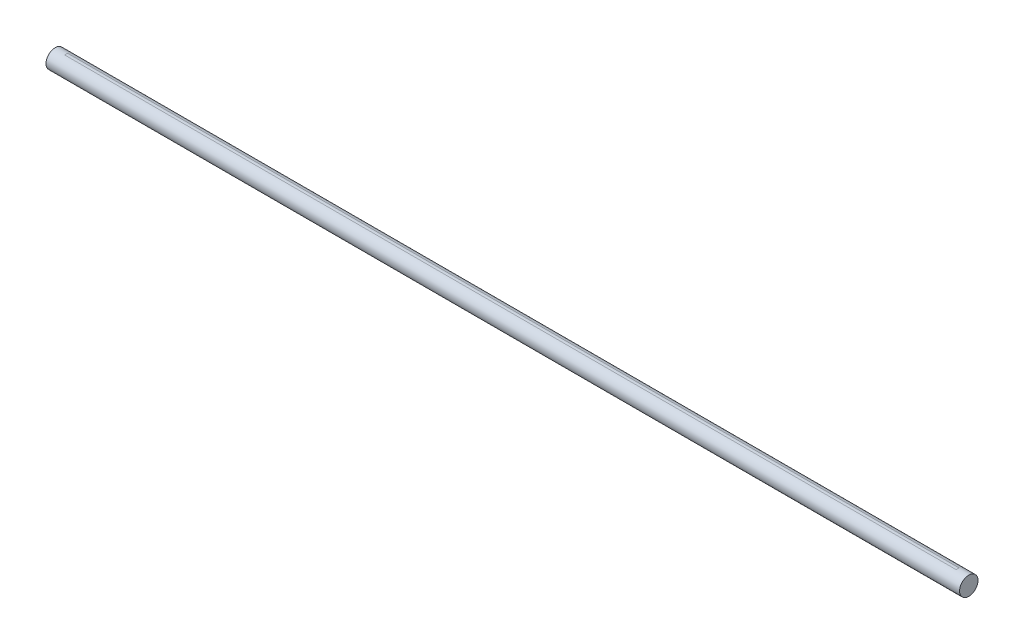
ISO-10303-21;
HEADER;
FILE_DESCRIPTION(('STEP AP214'),'2;1');
FILE_NAME('part.step','',(''),(''),'','','');
FILE_SCHEMA(('AUTOMOTIVE_DESIGN { 1 0 10303 214 1 1 1 1 }'));
ENDSEC;
DATA;
#1=APPLICATION_CONTEXT('core data for automotive mechanical design processes');
#2=APPLICATION_PROTOCOL_DEFINITION('international standard','automotive_design',2000,#1);
#3=PRODUCT_CONTEXT('',#1,'mechanical');
#4=PRODUCT('Part','Part','',(#3));
#5=PRODUCT_RELATED_PRODUCT_CATEGORY('part','',(#4));
#6=PRODUCT_DEFINITION_FORMATION('','',#4);
#7=PRODUCT_DEFINITION_CONTEXT('part definition',#1,'design');
#8=PRODUCT_DEFINITION('design','',#6,#7);
#9=PRODUCT_DEFINITION_SHAPE('','',#8);
#10=(LENGTH_UNIT() NAMED_UNIT(*) SI_UNIT(.MILLI.,.METRE.));
#11=(NAMED_UNIT(*) PLANE_ANGLE_UNIT() SI_UNIT($,.RADIAN.));
#12=(NAMED_UNIT(*) SI_UNIT($,.STERADIAN.) SOLID_ANGLE_UNIT());
#13=UNCERTAINTY_MEASURE_WITH_UNIT(LENGTH_MEASURE(1.E-05),#10,'distance_accuracy_value','');
#14=(GEOMETRIC_REPRESENTATION_CONTEXT(3) GLOBAL_UNCERTAINTY_ASSIGNED_CONTEXT((#13)) GLOBAL_UNIT_ASSIGNED_CONTEXT((#10,
#11,#12)) REPRESENTATION_CONTEXT('',''));
#15=CARTESIAN_POINT('',(0.,0.,0.));
#16=DIRECTION('',(0.,0.,1.));
#17=DIRECTION('',(1.,0.,0.));
#18=AXIS2_PLACEMENT_3D('',#15,#16,#17);
#19=CARTESIAN_POINT('',(-1574.8,0.,0.));
#20=DIRECTION('',(1.,0.,0.));
#21=DIRECTION('',(0.,0.,-1.));
#22=AXIS2_PLACEMENT_3D('',#19,#20,#21);
#23=CYLINDRICAL_SURFACE('',#22,15.875);
#24=CARTESIAN_POINT('',(-1574.8,0.,0.));
#25=DIRECTION('',(1.,0.,0.));
#26=DIRECTION('',(0.,0.,-1.));
#27=AXIS2_PLACEMENT_3D('',#24,#25,#26);
#28=CIRCLE('',#27,15.875);
#29=CARTESIAN_POINT('',(-1574.8,0.,-15.875));
#30=VERTEX_POINT('',#29);
#31=EDGE_CURVE('E97',#30,#30,#28,.T.);
#32=ORIENTED_EDGE('',*,*,#31,.T.);
#33=EDGE_LOOP('',(#32));
#34=FACE_BOUND('',#33,.T.);
#35=CARTESIAN_POINT('',(0.,0.,0.));
#36=DIRECTION('',(1.,0.,0.));
#37=DIRECTION('',(0.,0.,-1.));
#38=AXIS2_PLACEMENT_3D('',#35,#36,#37);
#39=CIRCLE('',#38,15.875);
#40=CARTESIAN_POINT('',(0.,0.,-15.875));
#41=VERTEX_POINT('',#40);
#42=EDGE_CURVE('E105',#41,#41,#39,.T.);
#43=ORIENTED_EDGE('',*,*,#42,.F.);
#44=EDGE_LOOP('',(#43));
#45=FACE_BOUND('',#44,.T.);
#46=DIRECTION('',(1.,0.,0.));
#47=VECTOR('',#46,1.);
#48=CARTESIAN_POINT('',(-1574.8,15.6704826026514,2.54));
#49=LINE('',#48,#47);
#50=CARTESIAN_POINT('',(-19.05,15.6704826026514,2.54));
#51=VERTEX_POINT('',#50);
#52=CARTESIAN_POINT('',(-1555.75,15.6704826026514,2.54));
#53=VERTEX_POINT('',#52);
#54=EDGE_CURVE('E91',#51,#53,#49,.F.);
#55=ORIENTED_EDGE('',*,*,#54,.T.);
#56=CARTESIAN_POINT('',(-1555.75,0.,0.));
#57=DIRECTION('',(1.,0.,0.));
#58=DIRECTION('',(0.,0.,-1.));
#59=AXIS2_PLACEMENT_3D('',#56,#57,#58);
#60=CIRCLE('',#59,15.875);
#61=CARTESIAN_POINT('',(-1555.75,15.6704826026514,-2.54));
#62=VERTEX_POINT('',#61);
#63=EDGE_CURVE('E60',#53,#62,#60,.F.);
#64=ORIENTED_EDGE('',*,*,#63,.T.);
#65=DIRECTION('',(1.,0.,0.));
#66=VECTOR('',#65,1.);
#67=CARTESIAN_POINT('',(-1574.8,15.6704826026514,-2.54));
#68=LINE('',#67,#66);
#69=CARTESIAN_POINT('',(-19.05,15.6704826026514,-2.54));
#70=VERTEX_POINT('',#69);
#71=EDGE_CURVE('E90',#62,#70,#68,.T.);
#72=ORIENTED_EDGE('',*,*,#71,.T.);
#73=CARTESIAN_POINT('',(-19.05,0.,0.));
#74=DIRECTION('',(-1.,0.,0.));
#75=DIRECTION('',(0.,0.,1.));
#76=AXIS2_PLACEMENT_3D('',#73,#74,#75);
#77=CIRCLE('',#76,15.875);
#78=EDGE_CURVE('E95',#70,#51,#77,.F.);
#79=ORIENTED_EDGE('',*,*,#78,.T.);
#80=EDGE_LOOP('',(#55,#64,#72,#79));
#81=FACE_BOUND('',#80,.T.);
#82=DIRECTION('',(1.,0.,0.));
#83=VECTOR('',#82,1.);
#84=CARTESIAN_POINT('',(-1574.8,-15.6704826026514,-2.54));
#85=LINE('',#84,#83);
#86=CARTESIAN_POINT('',(-19.05,-15.6704826026514,-2.54));
#87=VERTEX_POINT('',#86);
#88=CARTESIAN_POINT('',(-1555.75,-15.6704826026514,-2.54));
#89=VERTEX_POINT('',#88);
#90=EDGE_CURVE('E94',#87,#89,#85,.F.);
#91=ORIENTED_EDGE('',*,*,#90,.T.);
#92=CARTESIAN_POINT('',(-1555.75,-15.6704826026514,2.54));
#93=VERTEX_POINT('',#92);
#94=EDGE_CURVE('E11',#89,#93,#60,.F.);
#95=ORIENTED_EDGE('',*,*,#94,.T.);
#96=DIRECTION('',(1.,0.,0.));
#97=VECTOR('',#96,1.);
#98=CARTESIAN_POINT('',(-1574.8,-15.6704826026514,2.54));
#99=LINE('',#98,#97);
#100=CARTESIAN_POINT('',(-19.05,-15.6704826026514,2.54));
#101=VERTEX_POINT('',#100);
#102=EDGE_CURVE('E53',#93,#101,#99,.T.);
#103=ORIENTED_EDGE('',*,*,#102,.T.);
#104=EDGE_CURVE('E103',#101,#87,#77,.F.);
#105=ORIENTED_EDGE('',*,*,#104,.T.);
#106=EDGE_LOOP('',(#91,#95,#103,#105));
#107=FACE_BOUND('',#106,.T.);
#108=ADVANCED_FACE('F49',(#34,#45,#81,#107),#23,.T.);
#109=ORIENTED_EDGE('',*,*,#94,.F.);
#110=ORIENTED_EDGE('',*,*,#90,.F.);
#111=ORIENTED_EDGE('',*,*,#104,.F.);
#112=ORIENTED_EDGE('',*,*,#102,.F.);
#113=EDGE_LOOP('',(#109,#110,#111,#112));
#114=FACE_BOUND('',#113,.T.);
#115=ADVANCED_FACE('F123',(#114),#23,.T.);
#116=ORIENTED_EDGE('',*,*,#63,.F.);
#117=ORIENTED_EDGE('',*,*,#54,.F.);
#118=ORIENTED_EDGE('',*,*,#78,.F.);
#119=ORIENTED_EDGE('',*,*,#71,.F.);
#120=EDGE_LOOP('',(#116,#117,#118,#119));
#121=FACE_BOUND('',#120,.T.);
#122=ADVANCED_FACE('F51',(#121),#23,.T.);
#123=CARTESIAN_POINT('',(-1574.8,0.,0.));
#124=DIRECTION('',(1.,0.,0.));
#125=DIRECTION('',(0.,0.,-1.));
#126=AXIS2_PLACEMENT_3D('',#123,#124,#125);
#127=PLANE('',#126);
#128=ORIENTED_EDGE('',*,*,#31,.F.);
#129=EDGE_LOOP('',(#128));
#130=FACE_BOUND('',#129,.T.);
#131=ADVANCED_FACE('F128',(#130),#127,.F.);
#132=CARTESIAN_POINT('',(0.,0.,0.));
#133=DIRECTION('',(1.,0.,0.));
#134=DIRECTION('',(0.,0.,-1.));
#135=AXIS2_PLACEMENT_3D('',#132,#133,#134);
#136=PLANE('',#135);
#137=ORIENTED_EDGE('',*,*,#42,.T.);
#138=EDGE_LOOP('',(#137));
#139=FACE_BOUND('',#138,.T.);
#140=ADVANCED_FACE('F137',(#139),#136,.T.);
#141=CLOSED_SHELL('',(#108,#115,#122,#131,#140));
#142=MANIFOLD_SOLID_BREP('B2',#141);
#143=ADVANCED_BREP_SHAPE_REPRESENTATION('',(#18,#142),#14);
#144=SHAPE_DEFINITION_REPRESENTATION(#9,#143);
ENDSEC;
END-ISO-10303-21;
